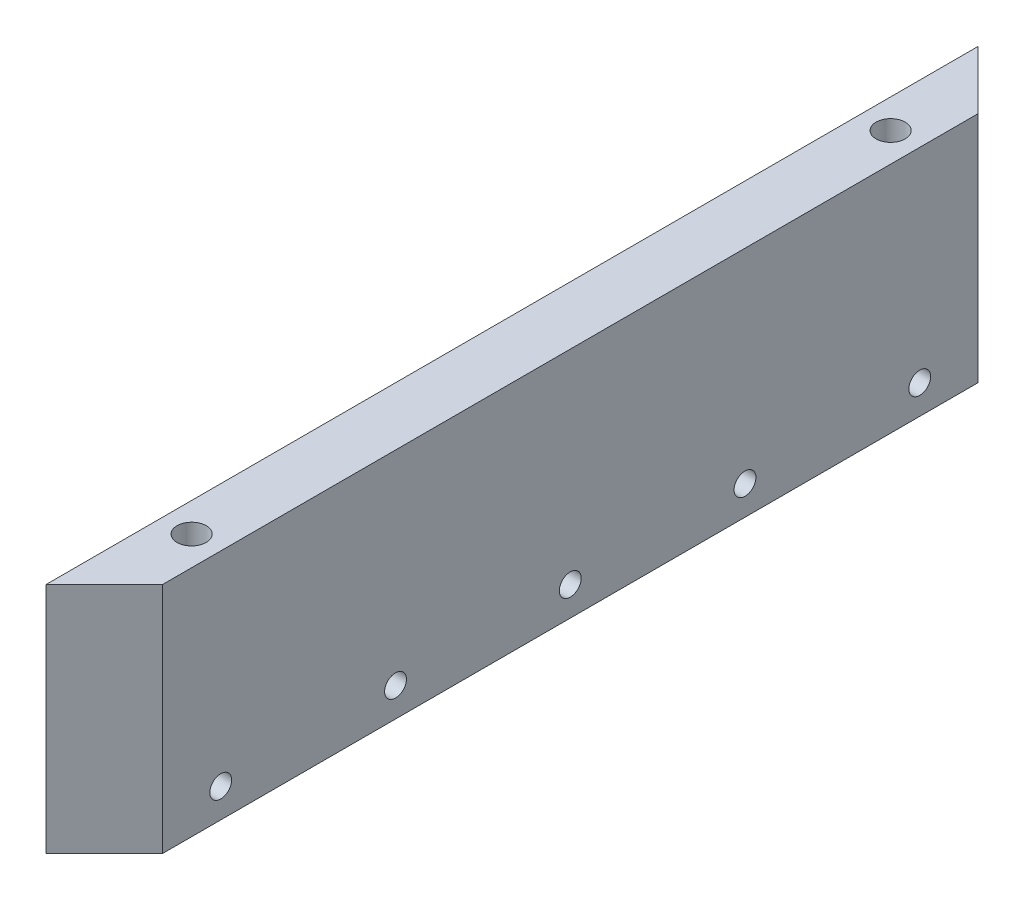
ISO-10303-21;
HEADER;
FILE_DESCRIPTION(('STEP AP214'),'2;1');
FILE_NAME('part.step','',(''),(''),'','','');
FILE_SCHEMA(('AUTOMOTIVE_DESIGN { 1 0 10303 214 1 1 1 1 }'));
ENDSEC;
DATA;
#1=APPLICATION_CONTEXT('core data for automotive mechanical design processes');
#2=APPLICATION_PROTOCOL_DEFINITION('international standard','automotive_design',2000,#1);
#3=PRODUCT_CONTEXT('',#1,'mechanical');
#4=PRODUCT('Part','Part','',(#3));
#5=PRODUCT_RELATED_PRODUCT_CATEGORY('part','',(#4));
#6=PRODUCT_DEFINITION_FORMATION('','',#4);
#7=PRODUCT_DEFINITION_CONTEXT('part definition',#1,'design');
#8=PRODUCT_DEFINITION('design','',#6,#7);
#9=PRODUCT_DEFINITION_SHAPE('','',#8);
#10=(LENGTH_UNIT() NAMED_UNIT(*) SI_UNIT(.MILLI.,.METRE.));
#11=(NAMED_UNIT(*) PLANE_ANGLE_UNIT() SI_UNIT($,.RADIAN.));
#12=(NAMED_UNIT(*) SI_UNIT($,.STERADIAN.) SOLID_ANGLE_UNIT());
#13=UNCERTAINTY_MEASURE_WITH_UNIT(LENGTH_MEASURE(1.E-05),#10,'distance_accuracy_value','');
#14=(GEOMETRIC_REPRESENTATION_CONTEXT(3) GLOBAL_UNCERTAINTY_ASSIGNED_CONTEXT((#13)) GLOBAL_UNIT_ASSIGNED_CONTEXT((#10,
#11,#12)) REPRESENTATION_CONTEXT('',''));
#15=CARTESIAN_POINT('',(0.,0.,0.));
#16=DIRECTION('',(0.,0.,1.));
#17=DIRECTION('',(1.,0.,0.));
#18=AXIS2_PLACEMENT_3D('',#15,#16,#17);
#19=CARTESIAN_POINT('',(12.7,-19.05,76.2));
#20=DIRECTION('',(-1.,0.,0.));
#21=DIRECTION('',(0.,0.,1.));
#22=AXIS2_PLACEMENT_3D('',#19,#20,#21);
#23=CYLINDRICAL_SURFACE('',#22,2.38125000000001);
#24=CARTESIAN_POINT('',(12.7,-19.05,76.2));
#25=DIRECTION('',(-1.,0.,0.));
#26=DIRECTION('',(0.,0.,1.));
#27=AXIS2_PLACEMENT_3D('',#24,#25,#26);
#28=CIRCLE('',#27,2.38125000000001);
#29=CARTESIAN_POINT('',(12.7,-19.05,78.58125));
#30=VERTEX_POINT('',#29);
#31=EDGE_CURVE('E40',#30,#30,#28,.T.);
#32=ORIENTED_EDGE('',*,*,#31,.F.);
#33=EDGE_LOOP('',(#32));
#34=FACE_BOUND('',#33,.T.);
#35=CARTESIAN_POINT('',(0.,-19.05,76.2));
#36=DIRECTION('',(-1.,0.,0.));
#37=DIRECTION('',(0.,0.,1.));
#38=AXIS2_PLACEMENT_3D('',#35,#36,#37);
#39=CIRCLE('',#38,2.38125000000001);
#40=CARTESIAN_POINT('',(0.,-19.05,78.58125));
#41=VERTEX_POINT('',#40);
#42=EDGE_CURVE('E11',#41,#41,#39,.T.);
#43=ORIENTED_EDGE('',*,*,#42,.T.);
#44=EDGE_LOOP('',(#43));
#45=FACE_BOUND('',#44,.T.);
#46=ADVANCED_FACE('F33',(#34,#45),#23,.F.);
#47=CARTESIAN_POINT('',(12.7,-19.05,38.1));
#48=DIRECTION('',(-1.,0.,0.));
#49=DIRECTION('',(0.,0.,1.));
#50=AXIS2_PLACEMENT_3D('',#47,#48,#49);
#51=CYLINDRICAL_SURFACE('',#50,2.38125000000001);
#52=CARTESIAN_POINT('',(12.7,-19.05,38.1));
#53=DIRECTION('',(-1.,0.,0.));
#54=DIRECTION('',(0.,0.,1.));
#55=AXIS2_PLACEMENT_3D('',#52,#53,#54);
#56=CIRCLE('',#55,2.38125000000001);
#57=CARTESIAN_POINT('',(12.7,-19.05,40.48125));
#58=VERTEX_POINT('',#57);
#59=EDGE_CURVE('E111',#58,#58,#56,.T.);
#60=ORIENTED_EDGE('',*,*,#59,.F.);
#61=EDGE_LOOP('',(#60));
#62=FACE_BOUND('',#61,.T.);
#63=CARTESIAN_POINT('',(0.,-19.05,38.1));
#64=DIRECTION('',(-1.,0.,0.));
#65=DIRECTION('',(0.,0.,1.));
#66=AXIS2_PLACEMENT_3D('',#63,#64,#65);
#67=CIRCLE('',#66,2.38125000000001);
#68=CARTESIAN_POINT('',(0.,-19.05,40.48125));
#69=VERTEX_POINT('',#68);
#70=EDGE_CURVE('E114',#69,#69,#67,.T.);
#71=ORIENTED_EDGE('',*,*,#70,.T.);
#72=EDGE_LOOP('',(#71));
#73=FACE_BOUND('',#72,.T.);
#74=ADVANCED_FACE('F122',(#62,#73),#51,.F.);
#75=CARTESIAN_POINT('',(12.7,-19.05,0.));
#76=DIRECTION('',(-1.,0.,0.));
#77=DIRECTION('',(0.,0.,1.));
#78=AXIS2_PLACEMENT_3D('',#75,#76,#77);
#79=CYLINDRICAL_SURFACE('',#78,2.38125000000001);
#80=CARTESIAN_POINT('',(12.7,-19.05,0.));
#81=DIRECTION('',(-1.,0.,0.));
#82=DIRECTION('',(0.,0.,1.));
#83=AXIS2_PLACEMENT_3D('',#80,#81,#82);
#84=CIRCLE('',#83,2.38125000000001);
#85=CARTESIAN_POINT('',(12.7,-19.05,2.38125000000002));
#86=VERTEX_POINT('',#85);
#87=EDGE_CURVE('E93',#86,#86,#84,.T.);
#88=ORIENTED_EDGE('',*,*,#87,.F.);
#89=EDGE_LOOP('',(#88));
#90=FACE_BOUND('',#89,.T.);
#91=CARTESIAN_POINT('',(0.,-19.05,0.));
#92=DIRECTION('',(-1.,0.,0.));
#93=DIRECTION('',(0.,0.,1.));
#94=AXIS2_PLACEMENT_3D('',#91,#92,#93);
#95=CIRCLE('',#94,2.38125000000001);
#96=CARTESIAN_POINT('',(0.,-19.05,2.38125000000002));
#97=VERTEX_POINT('',#96);
#98=EDGE_CURVE('E96',#97,#97,#95,.T.);
#99=ORIENTED_EDGE('',*,*,#98,.T.);
#100=EDGE_LOOP('',(#99));
#101=FACE_BOUND('',#100,.T.);
#102=ADVANCED_FACE('F145',(#90,#101),#79,.F.);
#103=CARTESIAN_POINT('',(12.7,25.4,101.6));
#104=DIRECTION('',(0.,-1.,0.));
#105=DIRECTION('',(0.,0.,-1.));
#106=AXIS2_PLACEMENT_3D('',#103,#104,#105);
#107=PLANE('',#106);
#108=CARTESIAN_POINT('',(6.34999999999998,25.4,76.2));
#109=DIRECTION('',(0.,1.,0.));
#110=DIRECTION('',(0.,0.,1.));
#111=AXIS2_PLACEMENT_3D('',#108,#109,#110);
#112=CIRCLE('',#111,3.175);
#113=CARTESIAN_POINT('',(6.34999999999998,25.4,79.375));
#114=VERTEX_POINT('',#113);
#115=EDGE_CURVE('E301',#114,#114,#112,.T.);
#116=ORIENTED_EDGE('',*,*,#115,.F.);
#117=EDGE_LOOP('',(#116));
#118=FACE_BOUND('',#117,.T.);
#119=CARTESIAN_POINT('',(6.35,25.4,-76.2));
#120=DIRECTION('',(0.,1.,0.));
#121=DIRECTION('',(0.,0.,1.));
#122=AXIS2_PLACEMENT_3D('',#119,#120,#121);
#123=CIRCLE('',#122,3.175);
#124=CARTESIAN_POINT('',(6.35,25.4,-73.025));
#125=VERTEX_POINT('',#124);
#126=EDGE_CURVE('E295',#125,#125,#123,.T.);
#127=ORIENTED_EDGE('',*,*,#126,.F.);
#128=EDGE_LOOP('',(#127));
#129=FACE_BOUND('',#128,.T.);
#130=DIRECTION('',(0.,0.,1.));
#131=VECTOR('',#130,1.);
#132=CARTESIAN_POINT('',(0.,25.4,101.6));
#133=LINE('',#132,#131);
#134=CARTESIAN_POINT('',(0.,25.4,-101.6));
#135=VERTEX_POINT('',#134);
#136=CARTESIAN_POINT('',(0.,25.4,101.6));
#137=VERTEX_POINT('',#136);
#138=EDGE_CURVE('E104',#135,#137,#133,.T.);
#139=ORIENTED_EDGE('',*,*,#138,.T.);
#140=DIRECTION('',(-0.707106781186537,0.,0.707106781186558));
#141=VECTOR('',#140,1.);
#142=CARTESIAN_POINT('',(0.,25.4,101.6));
#143=LINE('',#142,#141);
#144=CARTESIAN_POINT('',(12.7,25.4,88.8999999999996));
#145=VERTEX_POINT('',#144);
#146=EDGE_CURVE('E55',#145,#137,#143,.T.);
#147=ORIENTED_EDGE('',*,*,#146,.F.);
#148=DIRECTION('',(0.,0.,1.));
#149=VECTOR('',#148,1.);
#150=CARTESIAN_POINT('',(12.7,25.4,101.6));
#151=LINE('',#150,#149);
#152=CARTESIAN_POINT('',(12.7,25.4,-88.9000000000004));
#153=VERTEX_POINT('',#152);
#154=EDGE_CURVE('E89',#153,#145,#151,.T.);
#155=ORIENTED_EDGE('',*,*,#154,.F.);
#156=DIRECTION('',(0.707106781186559,0.,0.707106781186536));
#157=VECTOR('',#156,1.);
#158=CARTESIAN_POINT('',(0.,25.4,-101.6));
#159=LINE('',#158,#157);
#160=EDGE_CURVE('E90',#135,#153,#159,.T.);
#161=ORIENTED_EDGE('',*,*,#160,.F.);
#162=EDGE_LOOP('',(#139,#147,#155,#161));
#163=FACE_BOUND('',#162,.T.);
#164=ADVANCED_FACE('F142',(#118,#129,#163),#107,.F.);
#165=CARTESIAN_POINT('',(12.7,-25.4,101.6));
#166=DIRECTION('',(0.,1.,0.));
#167=DIRECTION('',(0.,0.,1.));
#168=AXIS2_PLACEMENT_3D('',#165,#166,#167);
#169=PLANE('',#168);
#170=DIRECTION('',(0.,0.,-1.));
#171=VECTOR('',#170,1.);
#172=CARTESIAN_POINT('',(12.7,-25.4,101.6));
#173=LINE('',#172,#171);
#174=CARTESIAN_POINT('',(12.7,-25.4,88.8999999999996));
#175=VERTEX_POINT('',#174);
#176=CARTESIAN_POINT('',(12.7,-25.4,-88.9000000000004));
#177=VERTEX_POINT('',#176);
#178=EDGE_CURVE('E87',#175,#177,#173,.T.);
#179=ORIENTED_EDGE('',*,*,#178,.F.);
#180=DIRECTION('',(-0.707106781186537,0.,0.707106781186558));
#181=VECTOR('',#180,1.);
#182=CARTESIAN_POINT('',(0.,-25.4,101.6));
#183=LINE('',#182,#181);
#184=CARTESIAN_POINT('',(0.,-25.4,101.6));
#185=VERTEX_POINT('',#184);
#186=EDGE_CURVE('E72',#175,#185,#183,.T.);
#187=ORIENTED_EDGE('',*,*,#186,.T.);
#188=DIRECTION('',(0.,0.,-1.));
#189=VECTOR('',#188,1.);
#190=CARTESIAN_POINT('',(0.,-25.4,101.6));
#191=LINE('',#190,#189);
#192=CARTESIAN_POINT('',(0.,-25.4,-101.6));
#193=VERTEX_POINT('',#192);
#194=EDGE_CURVE('E98',#185,#193,#191,.T.);
#195=ORIENTED_EDGE('',*,*,#194,.T.);
#196=DIRECTION('',(0.707106781186559,0.,0.707106781186536));
#197=VECTOR('',#196,1.);
#198=CARTESIAN_POINT('',(0.,-25.4,-101.6));
#199=LINE('',#198,#197);
#200=EDGE_CURVE('E47',#193,#177,#199,.T.);
#201=ORIENTED_EDGE('',*,*,#200,.T.);
#202=EDGE_LOOP('',(#179,#187,#195,#201));
#203=FACE_BOUND('',#202,.T.);
#204=ADVANCED_FACE('F92',(#203),#169,.F.);
#205=CARTESIAN_POINT('',(12.7,0.,0.));
#206=DIRECTION('',(1.,0.,0.));
#207=DIRECTION('',(0.,0.,-1.));
#208=AXIS2_PLACEMENT_3D('',#205,#206,#207);
#209=PLANE('',#208);
#210=CARTESIAN_POINT('',(12.7,-19.05,-38.1));
#211=DIRECTION('',(-1.,0.,0.));
#212=DIRECTION('',(0.,0.,1.));
#213=AXIS2_PLACEMENT_3D('',#210,#211,#212);
#214=CIRCLE('',#213,2.38125000000001);
#215=CARTESIAN_POINT('',(12.7,-19.05,-35.71875));
#216=VERTEX_POINT('',#215);
#217=EDGE_CURVE('E278',#216,#216,#214,.T.);
#218=ORIENTED_EDGE('',*,*,#217,.T.);
#219=EDGE_LOOP('',(#218));
#220=FACE_BOUND('',#219,.T.);
#221=CARTESIAN_POINT('',(12.7,-19.05,-76.2));
#222=DIRECTION('',(-1.,0.,0.));
#223=DIRECTION('',(0.,0.,1.));
#224=AXIS2_PLACEMENT_3D('',#221,#222,#223);
#225=CIRCLE('',#224,2.38125000000001);
#226=CARTESIAN_POINT('',(12.7,-19.05,-73.81875));
#227=VERTEX_POINT('',#226);
#228=EDGE_CURVE('E270',#227,#227,#225,.T.);
#229=ORIENTED_EDGE('',*,*,#228,.T.);
#230=EDGE_LOOP('',(#229));
#231=FACE_BOUND('',#230,.T.);
#232=DIRECTION('',(0.,1.,0.));
#233=VECTOR('',#232,1.);
#234=CARTESIAN_POINT('',(12.7,-25.4,88.8999999999996));
#235=LINE('',#234,#233);
#236=EDGE_CURVE('E75',#175,#145,#235,.T.);
#237=ORIENTED_EDGE('',*,*,#236,.F.);
#238=ORIENTED_EDGE('',*,*,#178,.T.);
#239=DIRECTION('',(0.,1.,0.));
#240=VECTOR('',#239,1.);
#241=CARTESIAN_POINT('',(12.7,-25.4,-88.9000000000004));
#242=LINE('',#241,#240);
#243=EDGE_CURVE('E105',#177,#153,#242,.T.);
#244=ORIENTED_EDGE('',*,*,#243,.T.);
#245=ORIENTED_EDGE('',*,*,#154,.T.);
#246=EDGE_LOOP('',(#237,#238,#244,#245));
#247=FACE_BOUND('',#246,.T.);
#248=ORIENTED_EDGE('',*,*,#87,.T.);
#249=EDGE_LOOP('',(#248));
#250=FACE_BOUND('',#249,.T.);
#251=ORIENTED_EDGE('',*,*,#59,.T.);
#252=EDGE_LOOP('',(#251));
#253=FACE_BOUND('',#252,.T.);
#254=ORIENTED_EDGE('',*,*,#31,.T.);
#255=EDGE_LOOP('',(#254));
#256=FACE_BOUND('',#255,.T.);
#257=ADVANCED_FACE('F84',(#220,#231,#247,#250,#253,#256),#209,.T.);
#258=CARTESIAN_POINT('',(0.,0.,0.));
#259=DIRECTION('',(1.,0.,0.));
#260=DIRECTION('',(0.,0.,-1.));
#261=AXIS2_PLACEMENT_3D('',#258,#259,#260);
#262=PLANE('',#261);
#263=CARTESIAN_POINT('',(0.,-19.05,-38.1));
#264=DIRECTION('',(-1.,0.,0.));
#265=DIRECTION('',(0.,0.,1.));
#266=AXIS2_PLACEMENT_3D('',#263,#264,#265);
#267=CIRCLE('',#266,2.38125000000001);
#268=CARTESIAN_POINT('',(0.,-19.05,-35.71875));
#269=VERTEX_POINT('',#268);
#270=EDGE_CURVE('E274',#269,#269,#267,.T.);
#271=ORIENTED_EDGE('',*,*,#270,.F.);
#272=EDGE_LOOP('',(#271));
#273=FACE_BOUND('',#272,.T.);
#274=CARTESIAN_POINT('',(0.,-19.05,-76.2));
#275=DIRECTION('',(-1.,0.,0.));
#276=DIRECTION('',(0.,0.,1.));
#277=AXIS2_PLACEMENT_3D('',#274,#275,#276);
#278=CIRCLE('',#277,2.38125000000001);
#279=CARTESIAN_POINT('',(0.,-19.05,-73.81875));
#280=VERTEX_POINT('',#279);
#281=EDGE_CURVE('E273',#280,#280,#278,.T.);
#282=ORIENTED_EDGE('',*,*,#281,.F.);
#283=EDGE_LOOP('',(#282));
#284=FACE_BOUND('',#283,.T.);
#285=DIRECTION('',(0.,1.,0.));
#286=VECTOR('',#285,1.);
#287=CARTESIAN_POINT('',(0.,25.4,-101.6));
#288=LINE('',#287,#286);
#289=EDGE_CURVE('E102',#193,#135,#288,.T.);
#290=ORIENTED_EDGE('',*,*,#289,.F.);
#291=ORIENTED_EDGE('',*,*,#194,.F.);
#292=DIRECTION('',(0.,-1.,0.));
#293=VECTOR('',#292,1.);
#294=CARTESIAN_POINT('',(0.,25.4,101.6));
#295=LINE('',#294,#293);
#296=EDGE_CURVE('E77',#137,#185,#295,.T.);
#297=ORIENTED_EDGE('',*,*,#296,.F.);
#298=ORIENTED_EDGE('',*,*,#138,.F.);
#299=EDGE_LOOP('',(#290,#291,#297,#298));
#300=FACE_BOUND('',#299,.T.);
#301=ORIENTED_EDGE('',*,*,#98,.F.);
#302=EDGE_LOOP('',(#301));
#303=FACE_BOUND('',#302,.T.);
#304=ORIENTED_EDGE('',*,*,#70,.F.);
#305=EDGE_LOOP('',(#304));
#306=FACE_BOUND('',#305,.T.);
#307=ORIENTED_EDGE('',*,*,#42,.F.);
#308=EDGE_LOOP('',(#307));
#309=FACE_BOUND('',#308,.T.);
#310=ADVANCED_FACE('F125',(#273,#284,#300,#303,#306,#309),#262,.F.);
#311=CARTESIAN_POINT('',(0.,-25.4,-101.6));
#312=DIRECTION('',(-0.707106781186536,0.,0.707106781186559));
#313=DIRECTION('',(0.707106781186559,0.,0.707106781186536));
#314=AXIS2_PLACEMENT_3D('',#311,#312,#313);
#315=PLANE('',#314);
#316=ORIENTED_EDGE('',*,*,#160,.T.);
#317=ORIENTED_EDGE('',*,*,#243,.F.);
#318=ORIENTED_EDGE('',*,*,#200,.F.);
#319=ORIENTED_EDGE('',*,*,#289,.T.);
#320=EDGE_LOOP('',(#316,#317,#318,#319));
#321=FACE_BOUND('',#320,.T.);
#322=ADVANCED_FACE('F127',(#321),#315,.F.);
#323=CARTESIAN_POINT('',(0.,-25.4,101.6));
#324=DIRECTION('',(-0.707106781186558,0.,-0.707106781186537));
#325=DIRECTION('',(-0.707106781186537,0.,0.707106781186558));
#326=AXIS2_PLACEMENT_3D('',#323,#324,#325);
#327=PLANE('',#326);
#328=ORIENTED_EDGE('',*,*,#146,.T.);
#329=ORIENTED_EDGE('',*,*,#296,.T.);
#330=ORIENTED_EDGE('',*,*,#186,.F.);
#331=ORIENTED_EDGE('',*,*,#236,.T.);
#332=EDGE_LOOP('',(#328,#329,#330,#331));
#333=FACE_BOUND('',#332,.T.);
#334=ADVANCED_FACE('F74',(#333),#327,.F.);
#335=CARTESIAN_POINT('',(12.7,-19.05,-76.2));
#336=DIRECTION('',(-1.,0.,0.));
#337=DIRECTION('',(0.,0.,1.));
#338=AXIS2_PLACEMENT_3D('',#335,#336,#337);
#339=CYLINDRICAL_SURFACE('',#338,2.38125000000001);
#340=ORIENTED_EDGE('',*,*,#228,.F.);
#341=EDGE_LOOP('',(#340));
#342=FACE_BOUND('',#341,.T.);
#343=ORIENTED_EDGE('',*,*,#281,.T.);
#344=EDGE_LOOP('',(#343));
#345=FACE_BOUND('',#344,.T.);
#346=ADVANCED_FACE('F193',(#342,#345),#339,.F.);
#347=CARTESIAN_POINT('',(12.7,-19.05,-38.1));
#348=DIRECTION('',(-1.,0.,0.));
#349=DIRECTION('',(0.,0.,1.));
#350=AXIS2_PLACEMENT_3D('',#347,#348,#349);
#351=CYLINDRICAL_SURFACE('',#350,2.38125000000001);
#352=ORIENTED_EDGE('',*,*,#217,.F.);
#353=EDGE_LOOP('',(#352));
#354=FACE_BOUND('',#353,.T.);
#355=ORIENTED_EDGE('',*,*,#270,.T.);
#356=EDGE_LOOP('',(#355));
#357=FACE_BOUND('',#356,.T.);
#358=ADVANCED_FACE('F188',(#354,#357),#351,.F.);
#359=CARTESIAN_POINT('',(6.35,12.7,-76.2));
#360=DIRECTION('',(0.,1.,0.));
#361=DIRECTION('',(0.,0.,1.));
#362=AXIS2_PLACEMENT_3D('',#359,#360,#361);
#363=CYLINDRICAL_SURFACE('',#362,3.175);
#364=CARTESIAN_POINT('',(6.35,12.7,-76.2));
#365=DIRECTION('',(0.,1.,0.));
#366=DIRECTION('',(0.,0.,1.));
#367=AXIS2_PLACEMENT_3D('',#364,#365,#366);
#368=CIRCLE('',#367,3.175);
#369=CARTESIAN_POINT('',(6.35,12.7,-73.025));
#370=VERTEX_POINT('',#369);
#371=EDGE_CURVE('E294',#370,#370,#368,.T.);
#372=ORIENTED_EDGE('',*,*,#371,.F.);
#373=EDGE_LOOP('',(#372));
#374=FACE_BOUND('',#373,.T.);
#375=ORIENTED_EDGE('',*,*,#126,.T.);
#376=EDGE_LOOP('',(#375));
#377=FACE_BOUND('',#376,.T.);
#378=ADVANCED_FACE('F192',(#374,#377),#363,.F.);
#379=CARTESIAN_POINT('',(6.35,12.7,-76.2));
#380=DIRECTION('',(0.,1.,0.));
#381=DIRECTION('',(0.,0.,1.));
#382=AXIS2_PLACEMENT_3D('',#379,#380,#381);
#383=PLANE('',#382);
#384=ORIENTED_EDGE('',*,*,#371,.T.);
#385=EDGE_LOOP('',(#384));
#386=FACE_BOUND('',#385,.T.);
#387=ADVANCED_FACE('F207',(#386),#383,.T.);
#388=CARTESIAN_POINT('',(6.34999999999998,12.7,76.2));
#389=DIRECTION('',(0.,1.,0.));
#390=DIRECTION('',(0.,0.,1.));
#391=AXIS2_PLACEMENT_3D('',#388,#389,#390);
#392=CYLINDRICAL_SURFACE('',#391,3.175);
#393=CARTESIAN_POINT('',(6.34999999999998,12.7,76.2));
#394=DIRECTION('',(0.,1.,0.));
#395=DIRECTION('',(0.,0.,1.));
#396=AXIS2_PLACEMENT_3D('',#393,#394,#395);
#397=CIRCLE('',#396,3.175);
#398=CARTESIAN_POINT('',(6.34999999999998,12.7,79.375));
#399=VERTEX_POINT('',#398);
#400=EDGE_CURVE('E298',#399,#399,#397,.T.);
#401=ORIENTED_EDGE('',*,*,#400,.F.);
#402=EDGE_LOOP('',(#401));
#403=FACE_BOUND('',#402,.T.);
#404=ORIENTED_EDGE('',*,*,#115,.T.);
#405=EDGE_LOOP('',(#404));
#406=FACE_BOUND('',#405,.T.);
#407=ADVANCED_FACE('F214',(#403,#406),#392,.F.);
#408=CARTESIAN_POINT('',(6.34999999999998,12.7,76.2));
#409=DIRECTION('',(0.,1.,0.));
#410=DIRECTION('',(0.,0.,1.));
#411=AXIS2_PLACEMENT_3D('',#408,#409,#410);
#412=PLANE('',#411);
#413=ORIENTED_EDGE('',*,*,#400,.T.);
#414=EDGE_LOOP('',(#413));
#415=FACE_BOUND('',#414,.T.);
#416=ADVANCED_FACE('F222',(#415),#412,.T.);
#417=CLOSED_SHELL('',(#46,#74,#102,#164,#204,#257,#310,#322,#334,#346,#358,#378,#387,#407,#416));
#418=MANIFOLD_SOLID_BREP('B2',#417);
#419=ADVANCED_BREP_SHAPE_REPRESENTATION('',(#18,#418),#14);
#420=SHAPE_DEFINITION_REPRESENTATION(#9,#419);
ENDSEC;
END-ISO-10303-21;
